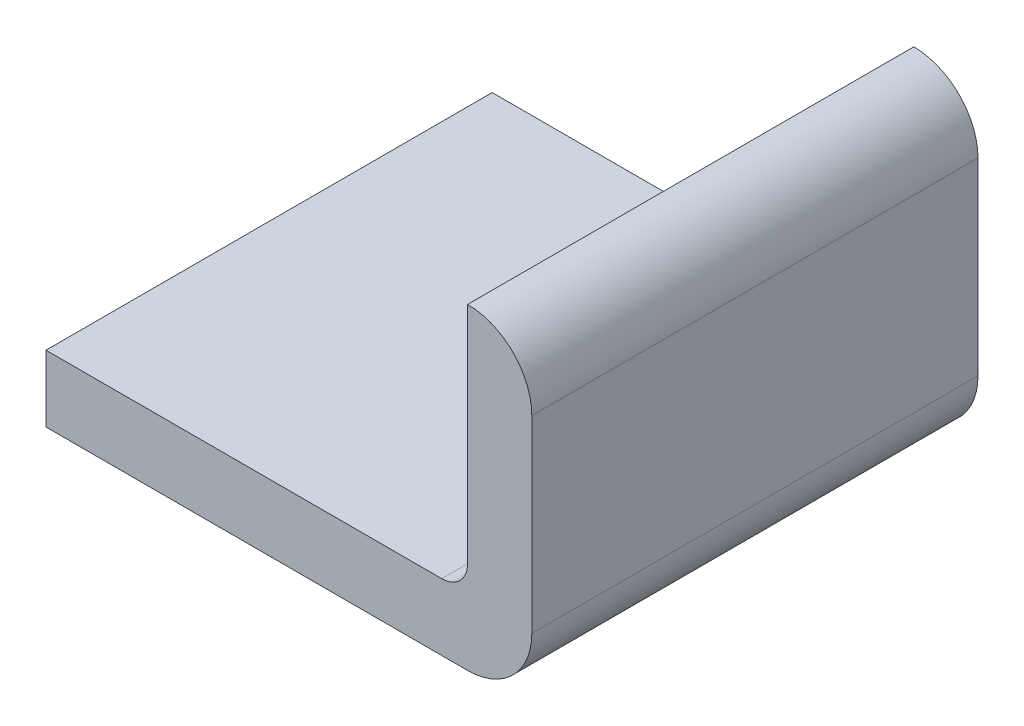
ISO-10303-21;
HEADER;
FILE_DESCRIPTION(('STEP AP214'),'2;1');
FILE_NAME('part.step','',(''),(''),'','','');
FILE_SCHEMA(('AUTOMOTIVE_DESIGN { 1 0 10303 214 1 1 1 1 }'));
ENDSEC;
DATA;
#1=APPLICATION_CONTEXT('core data for automotive mechanical design processes');
#2=APPLICATION_PROTOCOL_DEFINITION('international standard','automotive_design',2000,#1);
#3=PRODUCT_CONTEXT('',#1,'mechanical');
#4=PRODUCT('Part','Part','',(#3));
#5=PRODUCT_RELATED_PRODUCT_CATEGORY('part','',(#4));
#6=PRODUCT_DEFINITION_FORMATION('','',#4);
#7=PRODUCT_DEFINITION_CONTEXT('part definition',#1,'design');
#8=PRODUCT_DEFINITION('design','',#6,#7);
#9=PRODUCT_DEFINITION_SHAPE('','',#8);
#10=(LENGTH_UNIT() NAMED_UNIT(*) SI_UNIT(.MILLI.,.METRE.));
#11=(NAMED_UNIT(*) PLANE_ANGLE_UNIT() SI_UNIT($,.RADIAN.));
#12=(NAMED_UNIT(*) SI_UNIT($,.STERADIAN.) SOLID_ANGLE_UNIT());
#13=UNCERTAINTY_MEASURE_WITH_UNIT(LENGTH_MEASURE(1.E-05),#10,'distance_accuracy_value','');
#14=(GEOMETRIC_REPRESENTATION_CONTEXT(3) GLOBAL_UNCERTAINTY_ASSIGNED_CONTEXT((#13)) GLOBAL_UNIT_ASSIGNED_CONTEXT((#10,
#11,#12)) REPRESENTATION_CONTEXT('',''));
#15=CARTESIAN_POINT('',(0.,0.,0.));
#16=DIRECTION('',(0.,0.,1.));
#17=DIRECTION('',(1.,0.,0.));
#18=AXIS2_PLACEMENT_3D('',#15,#16,#17);
#19=CARTESIAN_POINT('',(0.,-0.434999914,-1.));
#20=DIRECTION('',(0.,-1.,0.));
#21=DIRECTION('',(1.,0.,0.));
#22=AXIS2_PLACEMENT_3D('',#19,#20,#21);
#23=PLANE('',#22);
#24=DIRECTION('',(1.,0.,0.));
#25=VECTOR('',#24,1.);
#26=CARTESIAN_POINT('',(0.,-0.434999914,-0.7745));
#27=LINE('',#26,#25);
#28=CARTESIAN_POINT('',(0.387000000000001,-0.434999914,-0.7745));
#29=VERTEX_POINT('',#28);
#30=CARTESIAN_POINT('',(0.919,-0.434999914,-0.7745));
#31=VERTEX_POINT('',#30);
#32=EDGE_CURVE('E11',#29,#31,#27,.T.);
#33=ORIENTED_EDGE('',*,*,#32,.T.);
#34=DIRECTION('',(0.,0.,1.));
#35=VECTOR('',#34,1.);
#36=CARTESIAN_POINT('',(0.919,-0.434999914,-1.));
#37=LINE('',#36,#35);
#38=CARTESIAN_POINT('',(0.919,-0.434999914,-0.2115));
#39=VERTEX_POINT('',#38);
#40=EDGE_CURVE('E24',#31,#39,#37,.T.);
#41=ORIENTED_EDGE('',*,*,#40,.T.);
#42=DIRECTION('',(-1.,0.,0.));
#43=VECTOR('',#42,1.);
#44=CARTESIAN_POINT('',(0.,-0.434999914,-0.2115));
#45=LINE('',#44,#43);
#46=CARTESIAN_POINT('',(0.387,-0.434999914,-0.2115));
#47=VERTEX_POINT('',#46);
#48=EDGE_CURVE('E142',#39,#47,#45,.T.);
#49=ORIENTED_EDGE('',*,*,#48,.T.);
#50=DIRECTION('',(0.,0.,-1.));
#51=VECTOR('',#50,1.);
#52=CARTESIAN_POINT('',(0.387,-0.434999914,-1.));
#53=LINE('',#52,#51);
#54=EDGE_CURVE('E140',#47,#29,#53,.T.);
#55=ORIENTED_EDGE('',*,*,#54,.T.);
#56=EDGE_LOOP('',(#33,#41,#49,#55));
#57=FACE_BOUND('',#56,.T.);
#58=ADVANCED_FACE('F17',(#57),#23,.T.);
#59=CARTESIAN_POINT('',(0.919,-0.353999914,-1.));
#60=DIRECTION('',(0.,0.,1.));
#61=DIRECTION('',(1.,0.,0.));
#62=AXIS2_PLACEMENT_3D('',#59,#60,#61);
#63=CYLINDRICAL_SURFACE('',#62,0.0810000000000004);
#64=CARTESIAN_POINT('',(0.919,-0.353999914,-0.7745));
#65=DIRECTION('',(0.,0.,1.));
#66=DIRECTION('',(1.,0.,0.));
#67=AXIS2_PLACEMENT_3D('',#64,#65,#66);
#68=CIRCLE('',#67,0.0810000000000004);
#69=CARTESIAN_POINT('',(1.,-0.353999914,-0.7745));
#70=VERTEX_POINT('',#69);
#71=EDGE_CURVE('E138',#31,#70,#68,.T.);
#72=ORIENTED_EDGE('',*,*,#71,.T.);
#73=DIRECTION('',(0.,0.,1.));
#74=VECTOR('',#73,1.);
#75=CARTESIAN_POINT('',(1.,-0.353999914,-1.));
#76=LINE('',#75,#74);
#77=CARTESIAN_POINT('',(1.,-0.353999914,-0.2115));
#78=VERTEX_POINT('',#77);
#79=EDGE_CURVE('E136',#70,#78,#76,.T.);
#80=ORIENTED_EDGE('',*,*,#79,.T.);
#81=CARTESIAN_POINT('',(0.919,-0.353999914,-0.2115));
#82=DIRECTION('',(0.,0.,-1.));
#83=DIRECTION('',(1.,0.,0.));
#84=AXIS2_PLACEMENT_3D('',#81,#82,#83);
#85=CIRCLE('',#84,0.0810000000000004);
#86=EDGE_CURVE('E85',#78,#39,#85,.T.);
#87=ORIENTED_EDGE('',*,*,#86,.T.);
#88=ORIENTED_EDGE('',*,*,#40,.F.);
#89=EDGE_LOOP('',(#72,#80,#87,#88));
#90=FACE_BOUND('',#89,.T.);
#91=ADVANCED_FACE('F147',(#90),#63,.T.);
#92=CARTESIAN_POINT('',(-1.,0.5,-0.7745));
#93=DIRECTION('',(0.,0.,1.));
#94=DIRECTION('',(1.,0.,0.));
#95=AXIS2_PLACEMENT_3D('',#92,#93,#94);
#96=PLANE('',#95);
#97=DIRECTION('',(0.,1.,0.));
#98=VECTOR('',#97,1.);
#99=CARTESIAN_POINT('',(1.,0.5,-0.7745));
#100=LINE('',#99,#98);
#101=CARTESIAN_POINT('',(1.,-0.115999914,-0.7745));
#102=VERTEX_POINT('',#101);
#103=EDGE_CURVE('E101',#70,#102,#100,.T.);
#104=ORIENTED_EDGE('',*,*,#103,.F.);
#105=ORIENTED_EDGE('',*,*,#71,.F.);
#106=ORIENTED_EDGE('',*,*,#32,.F.);
#107=DIRECTION('',(0.,-1.,0.));
#108=VECTOR('',#107,1.);
#109=CARTESIAN_POINT('',(0.387000000000001,0.5,-0.7745));
#110=LINE('',#109,#108);
#111=CARTESIAN_POINT('',(0.387000000000001,-0.351,-0.7745));
#112=VERTEX_POINT('',#111);
#113=EDGE_CURVE('E131',#112,#29,#110,.T.);
#114=ORIENTED_EDGE('',*,*,#113,.F.);
#115=DIRECTION('',(-1.,0.,0.));
#116=VECTOR('',#115,1.);
#117=CARTESIAN_POINT('',(-1.,-0.351,-0.7745));
#118=LINE('',#117,#116);
#119=CARTESIAN_POINT('',(0.88634664114407,-0.351,-0.7745));
#120=VERTEX_POINT('',#119);
#121=EDGE_CURVE('E128',#120,#112,#118,.T.);
#122=ORIENTED_EDGE('',*,*,#121,.F.);
#123=CARTESIAN_POINT('',(0.88634664114407,-0.31834664114407,-0.7745));
#124=DIRECTION('',(0.,0.,-1.));
#125=DIRECTION('',(1.,0.,0.));
#126=AXIS2_PLACEMENT_3D('',#123,#124,#125);
#127=CIRCLE('',#126,0.0326533588559299);
#128=CARTESIAN_POINT('',(0.919,-0.31834664114407,-0.7745));
#129=VERTEX_POINT('',#128);
#130=EDGE_CURVE('E125',#129,#120,#127,.T.);
#131=ORIENTED_EDGE('',*,*,#130,.F.);
#132=DIRECTION('',(0.,-1.,0.));
#133=VECTOR('',#132,1.);
#134=CARTESIAN_POINT('',(0.919,0.5,-0.7745));
#135=LINE('',#134,#133);
#136=CARTESIAN_POINT('',(0.919,-0.0349999139999999,-0.7745));
#137=VERTEX_POINT('',#136);
#138=EDGE_CURVE('E122',#137,#129,#135,.T.);
#139=ORIENTED_EDGE('',*,*,#138,.F.);
#140=CARTESIAN_POINT('',(0.919,-0.115999914,-0.7745));
#141=DIRECTION('',(0.,0.,1.));
#142=DIRECTION('',(1.,0.,0.));
#143=AXIS2_PLACEMENT_3D('',#140,#141,#142);
#144=CIRCLE('',#143,0.0810000000000004);
#145=EDGE_CURVE('E120',#102,#137,#144,.T.);
#146=ORIENTED_EDGE('',*,*,#145,.F.);
#147=EDGE_LOOP('',(#104,#105,#106,#114,#122,#131,#139,#146));
#148=FACE_BOUND('',#147,.T.);
#149=ADVANCED_FACE('F148',(#148),#96,.F.);
#150=CARTESIAN_POINT('',(0.387,0.,-1.));
#151=DIRECTION('',(-1.,0.,0.));
#152=DIRECTION('',(0.,0.,1.));
#153=AXIS2_PLACEMENT_3D('',#150,#151,#152);
#154=PLANE('',#153);
#155=ORIENTED_EDGE('',*,*,#113,.T.);
#156=ORIENTED_EDGE('',*,*,#54,.F.);
#157=DIRECTION('',(0.,1.,0.));
#158=VECTOR('',#157,1.);
#159=CARTESIAN_POINT('',(0.387,0.,-0.2115));
#160=LINE('',#159,#158);
#161=CARTESIAN_POINT('',(0.387000000000001,-0.351,-0.2115));
#162=VERTEX_POINT('',#161);
#163=EDGE_CURVE('E118',#47,#162,#160,.T.);
#164=ORIENTED_EDGE('',*,*,#163,.T.);
#165=DIRECTION('',(0.,0.,-1.));
#166=VECTOR('',#165,1.);
#167=CARTESIAN_POINT('',(0.387,-0.351,-1.));
#168=LINE('',#167,#166);
#169=EDGE_CURVE('E115',#162,#112,#168,.T.);
#170=ORIENTED_EDGE('',*,*,#169,.T.);
#171=EDGE_LOOP('',(#155,#156,#164,#170));
#172=FACE_BOUND('',#171,.T.);
#173=ADVANCED_FACE('F163',(#172),#154,.T.);
#174=CARTESIAN_POINT('',(-1.,0.5,-0.2115));
#175=DIRECTION('',(0.,0.,-1.));
#176=DIRECTION('',(-1.,0.,0.));
#177=AXIS2_PLACEMENT_3D('',#174,#175,#176);
#178=PLANE('',#177);
#179=DIRECTION('',(0.,1.,0.));
#180=VECTOR('',#179,1.);
#181=CARTESIAN_POINT('',(0.919,0.5,-0.2115));
#182=LINE('',#181,#180);
#183=CARTESIAN_POINT('',(0.919,-0.31834664114407,-0.2115));
#184=VERTEX_POINT('',#183);
#185=CARTESIAN_POINT('',(0.919,-0.0349999139999999,-0.2115));
#186=VERTEX_POINT('',#185);
#187=EDGE_CURVE('E113',#184,#186,#182,.T.);
#188=ORIENTED_EDGE('',*,*,#187,.F.);
#189=CARTESIAN_POINT('',(0.88634664114407,-0.31834664114407,-0.2115));
#190=DIRECTION('',(0.,0.,1.));
#191=DIRECTION('',(1.,0.,0.));
#192=AXIS2_PLACEMENT_3D('',#189,#190,#191);
#193=CIRCLE('',#192,0.0326533588559299);
#194=CARTESIAN_POINT('',(0.88634664114407,-0.351,-0.2115));
#195=VERTEX_POINT('',#194);
#196=EDGE_CURVE('E110',#195,#184,#193,.T.);
#197=ORIENTED_EDGE('',*,*,#196,.F.);
#198=DIRECTION('',(1.,0.,0.));
#199=VECTOR('',#198,1.);
#200=CARTESIAN_POINT('',(-1.,-0.351,-0.2115));
#201=LINE('',#200,#199);
#202=EDGE_CURVE('E89',#162,#195,#201,.T.);
#203=ORIENTED_EDGE('',*,*,#202,.F.);
#204=ORIENTED_EDGE('',*,*,#163,.F.);
#205=ORIENTED_EDGE('',*,*,#48,.F.);
#206=ORIENTED_EDGE('',*,*,#86,.F.);
#207=DIRECTION('',(0.,-1.,0.));
#208=VECTOR('',#207,1.);
#209=CARTESIAN_POINT('',(1.,0.5,-0.2115));
#210=LINE('',#209,#208);
#211=CARTESIAN_POINT('',(1.,-0.115999914,-0.2115));
#212=VERTEX_POINT('',#211);
#213=EDGE_CURVE('E78',#212,#78,#210,.T.);
#214=ORIENTED_EDGE('',*,*,#213,.F.);
#215=CARTESIAN_POINT('',(0.919,-0.115999914,-0.2115));
#216=DIRECTION('',(0.,0.,-1.));
#217=DIRECTION('',(1.,0.,0.));
#218=AXIS2_PLACEMENT_3D('',#215,#216,#217);
#219=CIRCLE('',#218,0.0810000000000004);
#220=EDGE_CURVE('E81',#186,#212,#219,.T.);
#221=ORIENTED_EDGE('',*,*,#220,.F.);
#222=EDGE_LOOP('',(#188,#197,#203,#204,#205,#206,#214,#221));
#223=FACE_BOUND('',#222,.T.);
#224=ADVANCED_FACE('F80',(#223),#178,.F.);
#225=CARTESIAN_POINT('',(1.,0.,-1.));
#226=DIRECTION('',(1.,0.,0.));
#227=DIRECTION('',(0.,0.,-1.));
#228=AXIS2_PLACEMENT_3D('',#225,#226,#227);
#229=PLANE('',#228);
#230=ORIENTED_EDGE('',*,*,#103,.T.);
#231=DIRECTION('',(0.,0.,1.));
#232=VECTOR('',#231,1.);
#233=CARTESIAN_POINT('',(1.,-0.115999914,-1.));
#234=LINE('',#233,#232);
#235=EDGE_CURVE('E95',#102,#212,#234,.T.);
#236=ORIENTED_EDGE('',*,*,#235,.T.);
#237=ORIENTED_EDGE('',*,*,#213,.T.);
#238=ORIENTED_EDGE('',*,*,#79,.F.);
#239=EDGE_LOOP('',(#230,#236,#237,#238));
#240=FACE_BOUND('',#239,.T.);
#241=ADVANCED_FACE('F99',(#240),#229,.T.);
#242=CARTESIAN_POINT('',(0.919,-0.115999914,-1.));
#243=DIRECTION('',(0.,0.,1.));
#244=DIRECTION('',(1.,0.,0.));
#245=AXIS2_PLACEMENT_3D('',#242,#243,#244);
#246=CYLINDRICAL_SURFACE('',#245,0.0810000000000004);
#247=ORIENTED_EDGE('',*,*,#145,.T.);
#248=DIRECTION('',(0.,0.,1.));
#249=VECTOR('',#248,1.);
#250=CARTESIAN_POINT('',(0.919,-0.0349999139999999,-1.));
#251=LINE('',#250,#249);
#252=EDGE_CURVE('E97',#137,#186,#251,.T.);
#253=ORIENTED_EDGE('',*,*,#252,.T.);
#254=ORIENTED_EDGE('',*,*,#220,.T.);
#255=ORIENTED_EDGE('',*,*,#235,.F.);
#256=EDGE_LOOP('',(#247,#253,#254,#255));
#257=FACE_BOUND('',#256,.T.);
#258=ADVANCED_FACE('F94',(#257),#246,.T.);
#259=CARTESIAN_POINT('',(0.,-0.351,-1.));
#260=DIRECTION('',(0.,-1.,0.));
#261=DIRECTION('',(1.,0.,0.));
#262=AXIS2_PLACEMENT_3D('',#259,#260,#261);
#263=PLANE('',#262);
#264=ORIENTED_EDGE('',*,*,#202,.T.);
#265=DIRECTION('',(0.,0.,1.));
#266=VECTOR('',#265,1.);
#267=CARTESIAN_POINT('',(0.88634664114407,-0.351,-1.));
#268=LINE('',#267,#266);
#269=EDGE_CURVE('E104',#120,#195,#268,.T.);
#270=ORIENTED_EDGE('',*,*,#269,.F.);
#271=ORIENTED_EDGE('',*,*,#121,.T.);
#272=ORIENTED_EDGE('',*,*,#169,.F.);
#273=EDGE_LOOP('',(#264,#270,#271,#272));
#274=FACE_BOUND('',#273,.T.);
#275=ADVANCED_FACE('F160',(#274),#263,.F.);
#276=CARTESIAN_POINT('',(0.88634664114407,-0.31834664114407,-1.));
#277=DIRECTION('',(0.,0.,1.));
#278=DIRECTION('',(1.,0.,0.));
#279=AXIS2_PLACEMENT_3D('',#276,#277,#278);
#280=CYLINDRICAL_SURFACE('',#279,0.0326533588559299);
#281=ORIENTED_EDGE('',*,*,#196,.T.);
#282=DIRECTION('',(0.,0.,1.));
#283=VECTOR('',#282,1.);
#284=CARTESIAN_POINT('',(0.919,-0.31834664114407,-1.));
#285=LINE('',#284,#283);
#286=EDGE_CURVE('E153',#129,#184,#285,.T.);
#287=ORIENTED_EDGE('',*,*,#286,.F.);
#288=ORIENTED_EDGE('',*,*,#130,.T.);
#289=ORIENTED_EDGE('',*,*,#269,.T.);
#290=EDGE_LOOP('',(#281,#287,#288,#289));
#291=FACE_BOUND('',#290,.T.);
#292=ADVANCED_FACE('F156',(#291),#280,.F.);
#293=CARTESIAN_POINT('',(0.919,0.,-1.));
#294=DIRECTION('',(1.,0.,0.));
#295=DIRECTION('',(0.,0.,-1.));
#296=AXIS2_PLACEMENT_3D('',#293,#294,#295);
#297=PLANE('',#296);
#298=ORIENTED_EDGE('',*,*,#187,.T.);
#299=ORIENTED_EDGE('',*,*,#252,.F.);
#300=ORIENTED_EDGE('',*,*,#138,.T.);
#301=ORIENTED_EDGE('',*,*,#286,.T.);
#302=EDGE_LOOP('',(#298,#299,#300,#301));
#303=FACE_BOUND('',#302,.T.);
#304=ADVANCED_FACE('F150',(#303),#297,.F.);
#305=CLOSED_SHELL('',(#58,#91,#149,#173,#224,#241,#258,#275,#292,#304));
#306=MANIFOLD_SOLID_BREP('B1',#305);
#307=ADVANCED_BREP_SHAPE_REPRESENTATION('',(#18,#306),#14);
#308=SHAPE_DEFINITION_REPRESENTATION(#9,#307);
ENDSEC;
END-ISO-10303-21;
